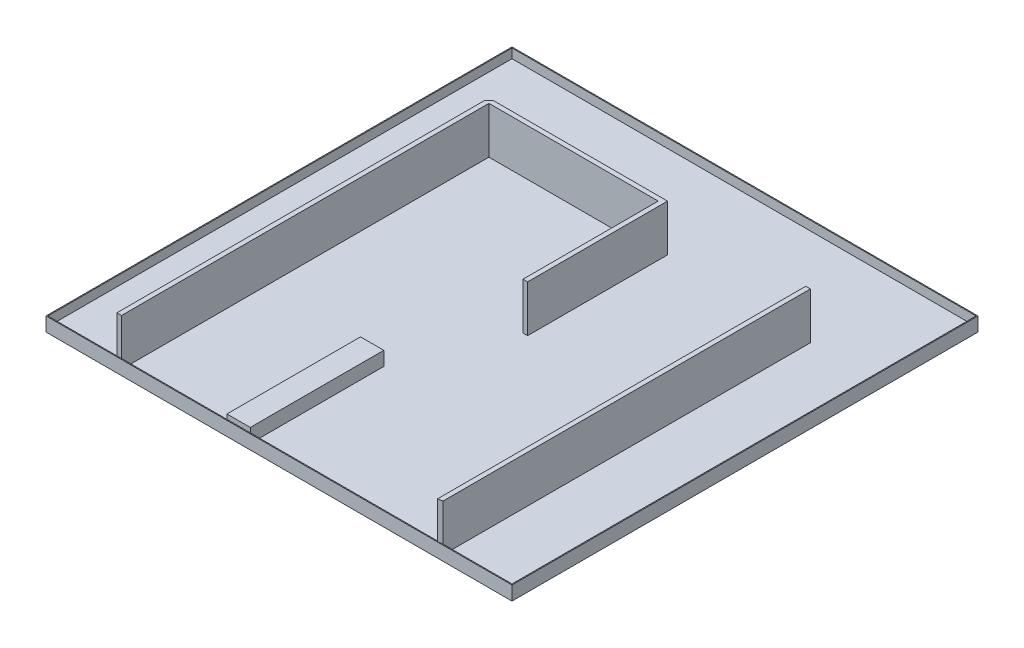
ISO-10303-21;
HEADER;
FILE_DESCRIPTION(('STEP AP214'),'2;1');
FILE_NAME('part.step','',(''),(''),'','','');
FILE_SCHEMA(('AUTOMOTIVE_DESIGN { 1 0 10303 214 1 1 1 1 }'));
ENDSEC;
DATA;
#1=APPLICATION_CONTEXT('core data for automotive mechanical design processes');
#2=APPLICATION_PROTOCOL_DEFINITION('international standard','automotive_design',2000,#1);
#3=PRODUCT_CONTEXT('',#1,'mechanical');
#4=PRODUCT('Part','Part','',(#3));
#5=PRODUCT_RELATED_PRODUCT_CATEGORY('part','',(#4));
#6=PRODUCT_DEFINITION_FORMATION('','',#4);
#7=PRODUCT_DEFINITION_CONTEXT('part definition',#1,'design');
#8=PRODUCT_DEFINITION('design','',#6,#7);
#9=PRODUCT_DEFINITION_SHAPE('','',#8);
#10=(LENGTH_UNIT() NAMED_UNIT(*) SI_UNIT(.MILLI.,.METRE.));
#11=(NAMED_UNIT(*) PLANE_ANGLE_UNIT() SI_UNIT($,.RADIAN.));
#12=(NAMED_UNIT(*) SI_UNIT($,.STERADIAN.) SOLID_ANGLE_UNIT());
#13=UNCERTAINTY_MEASURE_WITH_UNIT(LENGTH_MEASURE(1.E-05),#10,'distance_accuracy_value','');
#14=(GEOMETRIC_REPRESENTATION_CONTEXT(3) GLOBAL_UNCERTAINTY_ASSIGNED_CONTEXT((#13)) GLOBAL_UNIT_ASSIGNED_CONTEXT((#10,
#11,#12)) REPRESENTATION_CONTEXT('',''));
#15=CARTESIAN_POINT('',(0.,0.,0.));
#16=DIRECTION('',(0.,0.,1.));
#17=DIRECTION('',(1.,0.,0.));
#18=AXIS2_PLACEMENT_3D('',#15,#16,#17);
#19=CARTESIAN_POINT('',(-4980.,300.,4980.));
#20=DIRECTION('',(0.,0.,-1.));
#21=DIRECTION('',(-1.,0.,0.));
#22=AXIS2_PLACEMENT_3D('',#19,#20,#21);
#23=PLANE('',#22);
#24=DIRECTION('',(1.,0.,0.));
#25=VECTOR('',#24,1.);
#26=CARTESIAN_POINT('',(-4980.,100.,4980.));
#27=LINE('',#26,#25);
#28=CARTESIAN_POINT('',(-636.643182600913,100.,4980.));
#29=VERTEX_POINT('',#28);
#30=CARTESIAN_POINT('',(3400.,100.,4980.));
#31=VERTEX_POINT('',#30);
#32=EDGE_CURVE('E393',#29,#31,#27,.T.);
#33=ORIENTED_EDGE('',*,*,#32,.F.);
#34=DIRECTION('',(0.,-1.,0.));
#35=VECTOR('',#34,1.);
#36=CARTESIAN_POINT('',(-636.643182600912,400.,4980.));
#37=LINE('',#36,#35);
#38=CARTESIAN_POINT('',(-636.643182600912,300.,4980.));
#39=VERTEX_POINT('',#38);
#40=EDGE_CURVE('E490',#39,#29,#37,.T.);
#41=ORIENTED_EDGE('',*,*,#40,.F.);
#42=DIRECTION('',(1.,0.,0.));
#43=VECTOR('',#42,1.);
#44=CARTESIAN_POINT('',(-4980.,300.,4980.));
#45=LINE('',#44,#43);
#46=CARTESIAN_POINT('',(3400.,300.,4980.));
#47=VERTEX_POINT('',#46);
#48=EDGE_CURVE('E380',#39,#47,#45,.T.);
#49=ORIENTED_EDGE('',*,*,#48,.T.);
#50=DIRECTION('',(0.,-1.,0.));
#51=VECTOR('',#50,1.);
#52=CARTESIAN_POINT('',(3400.,300.,4980.));
#53=LINE('',#52,#51);
#54=EDGE_CURVE('E356',#47,#31,#53,.T.);
#55=ORIENTED_EDGE('',*,*,#54,.T.);
#56=EDGE_LOOP('',(#33,#41,#49,#55));
#57=FACE_BOUND('',#56,.T.);
#58=ADVANCED_FACE('F35',(#57),#23,.T.);
#59=CARTESIAN_POINT('',(-3397.93653042771,300.,4980.));
#60=VERTEX_POINT('',#59);
#61=CARTESIAN_POINT('',(-1136.64318260091,300.,4980.));
#62=VERTEX_POINT('',#61);
#63=EDGE_CURVE('E379',#60,#62,#45,.T.);
#64=ORIENTED_EDGE('',*,*,#63,.T.);
#65=DIRECTION('',(0.,-1.,0.));
#66=VECTOR('',#65,1.);
#67=CARTESIAN_POINT('',(-1136.64318260091,400.,4980.));
#68=LINE('',#67,#66);
#69=CARTESIAN_POINT('',(-1136.64318260091,100.,4980.));
#70=VERTEX_POINT('',#69);
#71=EDGE_CURVE('E491',#62,#70,#68,.T.);
#72=ORIENTED_EDGE('',*,*,#71,.T.);
#73=CARTESIAN_POINT('',(-3397.93653042772,100.,4980.));
#74=VERTEX_POINT('',#73);
#75=EDGE_CURVE('E392',#74,#70,#27,.T.);
#76=ORIENTED_EDGE('',*,*,#75,.F.);
#77=DIRECTION('',(0.,-1.,0.));
#78=VECTOR('',#77,1.);
#79=CARTESIAN_POINT('',(-3397.93653042771,1100.,4980.));
#80=LINE('',#79,#78);
#81=EDGE_CURVE('E311',#60,#74,#80,.T.);
#82=ORIENTED_EDGE('',*,*,#81,.F.);
#83=EDGE_LOOP('',(#64,#72,#76,#82));
#84=FACE_BOUND('',#83,.T.);
#85=ADVANCED_FACE('F501',(#84),#23,.T.);
#86=CARTESIAN_POINT('',(0.,100.,0.));
#87=DIRECTION('',(0.,-1.,0.));
#88=DIRECTION('',(0.,0.,-1.));
#89=AXIS2_PLACEMENT_3D('',#86,#87,#88);
#90=PLANE('',#89);
#91=DIRECTION('',(0.,0.,-1.));
#92=VECTOR('',#91,1.);
#93=CARTESIAN_POINT('',(-636.643182600912,100.,4980.));
#94=LINE('',#93,#92);
#95=CARTESIAN_POINT('',(-636.643182600912,100.,2114.56592078458));
#96=VERTEX_POINT('',#95);
#97=EDGE_CURVE('E244',#29,#96,#94,.T.);
#98=ORIENTED_EDGE('',*,*,#97,.F.);
#99=ORIENTED_EDGE('',*,*,#32,.T.);
#100=DIRECTION('',(0.,0.,1.));
#101=VECTOR('',#100,1.);
#102=CARTESIAN_POINT('',(3400.,100.,5000.));
#103=LINE('',#102,#101);
#104=CARTESIAN_POINT('',(3400.,100.,-2903.04812853476));
#105=VERTEX_POINT('',#104);
#106=EDGE_CURVE('E330',#105,#31,#103,.T.);
#107=ORIENTED_EDGE('',*,*,#106,.F.);
#108=DIRECTION('',(-1.,0.,0.));
#109=VECTOR('',#108,1.);
#110=CARTESIAN_POINT('',(3400.,100.,-2903.04812853476));
#111=LINE('',#110,#109);
#112=CARTESIAN_POINT('',(3500.,100.,-2903.04812853476));
#113=VERTEX_POINT('',#112);
#114=EDGE_CURVE('E339',#113,#105,#111,.T.);
#115=ORIENTED_EDGE('',*,*,#114,.F.);
#116=DIRECTION('',(0.,0.,-1.));
#117=VECTOR('',#116,1.);
#118=CARTESIAN_POINT('',(3500.,100.,4980.));
#119=LINE('',#118,#117);
#120=CARTESIAN_POINT('',(3500.,100.,4980.));
#121=VERTEX_POINT('',#120);
#122=EDGE_CURVE('E325',#121,#113,#119,.T.);
#123=ORIENTED_EDGE('',*,*,#122,.F.);
#124=CARTESIAN_POINT('',(4980.,100.,4980.));
#125=VERTEX_POINT('',#124);
#126=EDGE_CURVE('E389',#121,#125,#27,.T.);
#127=ORIENTED_EDGE('',*,*,#126,.T.);
#128=DIRECTION('',(0.,0.,-1.));
#129=VECTOR('',#128,1.);
#130=CARTESIAN_POINT('',(4980.,100.,4980.));
#131=LINE('',#130,#129);
#132=CARTESIAN_POINT('',(4980.,100.,-4980.));
#133=VERTEX_POINT('',#132);
#134=EDGE_CURVE('E365',#125,#133,#131,.T.);
#135=ORIENTED_EDGE('',*,*,#134,.T.);
#136=DIRECTION('',(-1.,0.,0.));
#137=VECTOR('',#136,1.);
#138=CARTESIAN_POINT('',(-4980.,100.,-4980.));
#139=LINE('',#138,#137);
#140=CARTESIAN_POINT('',(-4980.,100.,-4980.));
#141=VERTEX_POINT('',#140);
#142=EDGE_CURVE('E383',#133,#141,#139,.T.);
#143=ORIENTED_EDGE('',*,*,#142,.T.);
#144=DIRECTION('',(0.,0.,1.));
#145=VECTOR('',#144,1.);
#146=CARTESIAN_POINT('',(-4980.,100.,4980.));
#147=LINE('',#146,#145);
#148=CARTESIAN_POINT('',(-4980.,100.,4980.));
#149=VERTEX_POINT('',#148);
#150=EDGE_CURVE('E386',#141,#149,#147,.T.);
#151=ORIENTED_EDGE('',*,*,#150,.T.);
#152=CARTESIAN_POINT('',(-3497.93653042771,100.,4980.));
#153=VERTEX_POINT('',#152);
#154=EDGE_CURVE('E369',#149,#153,#27,.T.);
#155=ORIENTED_EDGE('',*,*,#154,.T.);
#156=DIRECTION('',(0.,0.,1.));
#157=VECTOR('',#156,1.);
#158=CARTESIAN_POINT('',(-3497.93653042772,100.,-2903.04812853476));
#159=LINE('',#158,#157);
#160=CARTESIAN_POINT('',(-3497.93653042771,100.,-2903.04812853476));
#161=VERTEX_POINT('',#160);
#162=EDGE_CURVE('E248',#161,#153,#159,.T.);
#163=ORIENTED_EDGE('',*,*,#162,.F.);
#164=DIRECTION('',(-0.707106781186546,0.,0.707106781186549));
#165=VECTOR('',#164,1.);
#166=CARTESIAN_POINT('',(-3497.93653042772,100.,-2903.04812853476));
#167=LINE('',#166,#165);
#168=CARTESIAN_POINT('',(-3397.93653042772,100.,-3003.04812853476));
#169=VERTEX_POINT('',#168);
#170=EDGE_CURVE('E245',#169,#161,#167,.T.);
#171=ORIENTED_EDGE('',*,*,#170,.F.);
#172=DIRECTION('',(-1.,0.,0.));
#173=VECTOR('',#172,1.);
#174=CARTESIAN_POINT('',(334.695730022103,100.,-3003.04812853476));
#175=LINE('',#174,#173);
#176=CARTESIAN_POINT('',(334.695730022103,100.,-3003.04812853476));
#177=VERTEX_POINT('',#176);
#178=EDGE_CURVE('E258',#177,#169,#175,.T.);
#179=ORIENTED_EDGE('',*,*,#178,.F.);
#180=DIRECTION('',(0.,0.,-1.));
#181=VECTOR('',#180,1.);
#182=CARTESIAN_POINT('',(334.695730022103,100.,-2903.04812853476));
#183=LINE('',#182,#181);
#184=CARTESIAN_POINT('',(334.695730022101,100.,0.));
#185=VERTEX_POINT('',#184);
#186=EDGE_CURVE('E289',#185,#177,#183,.T.);
#187=ORIENTED_EDGE('',*,*,#186,.F.);
#188=DIRECTION('',(1.,0.,0.));
#189=VECTOR('',#188,1.);
#190=CARTESIAN_POINT('',(234.695730022103,100.,0.));
#191=LINE('',#190,#189);
#192=CARTESIAN_POINT('',(234.695730022103,100.,0.));
#193=VERTEX_POINT('',#192);
#194=EDGE_CURVE('E286',#193,#185,#191,.T.);
#195=ORIENTED_EDGE('',*,*,#194,.F.);
#196=DIRECTION('',(0.,0.,1.));
#197=VECTOR('',#196,1.);
#198=CARTESIAN_POINT('',(234.695730022103,100.,-2903.04812853476));
#199=LINE('',#198,#197);
#200=CARTESIAN_POINT('',(234.695730022103,100.,-2903.04812853476));
#201=VERTEX_POINT('',#200);
#202=EDGE_CURVE('E283',#201,#193,#199,.T.);
#203=ORIENTED_EDGE('',*,*,#202,.F.);
#204=DIRECTION('',(1.,0.,0.));
#205=VECTOR('',#204,1.);
#206=CARTESIAN_POINT('',(234.695730022103,100.,-2903.04812853476));
#207=LINE('',#206,#205);
#208=CARTESIAN_POINT('',(-3397.93653042772,100.,-2903.04812853476));
#209=VERTEX_POINT('',#208);
#210=EDGE_CURVE('E280',#209,#201,#207,.T.);
#211=ORIENTED_EDGE('',*,*,#210,.F.);
#212=DIRECTION('',(0.,0.,-1.));
#213=VECTOR('',#212,1.);
#214=CARTESIAN_POINT('',(-3397.93653042772,100.,-2903.04812853476));
#215=LINE('',#214,#213);
#216=EDGE_CURVE('E277',#74,#209,#215,.T.);
#217=ORIENTED_EDGE('',*,*,#216,.F.);
#218=ORIENTED_EDGE('',*,*,#75,.T.);
#219=DIRECTION('',(0.,0.,1.));
#220=VECTOR('',#219,1.);
#221=CARTESIAN_POINT('',(-1136.64318260091,100.,4980.));
#222=LINE('',#221,#220);
#223=CARTESIAN_POINT('',(-1136.64318260091,100.,2114.56592078458));
#224=VERTEX_POINT('',#223);
#225=EDGE_CURVE('E55',#224,#70,#222,.T.);
#226=ORIENTED_EDGE('',*,*,#225,.F.);
#227=DIRECTION('',(-1.,0.,0.));
#228=VECTOR('',#227,1.);
#229=CARTESIAN_POINT('',(-636.643182600912,100.,2114.56592078458));
#230=LINE('',#229,#228);
#231=EDGE_CURVE('E50',#96,#224,#230,.T.);
#232=ORIENTED_EDGE('',*,*,#231,.F.);
#233=EDGE_LOOP('',(#98,#99,#107,#115,#123,#127,#135,#143,#151,#155,#163,#171,#179,#187,#195,
#203,#211,#217,#218,#226,#232));
#234=FACE_BOUND('',#233,.T.);
#235=ADVANCED_FACE('F468',(#234),#90,.F.);
#236=CARTESIAN_POINT('',(-4980.,300.,4980.));
#237=VERTEX_POINT('',#236);
#238=CARTESIAN_POINT('',(-3497.93653042771,300.,4980.));
#239=VERTEX_POINT('',#238);
#240=EDGE_CURVE('E375',#237,#239,#45,.T.);
#241=ORIENTED_EDGE('',*,*,#240,.T.);
#242=DIRECTION('',(0.,-1.,0.));
#243=VECTOR('',#242,1.);
#244=CARTESIAN_POINT('',(-3497.93653042771,1100.,4980.));
#245=LINE('',#244,#243);
#246=EDGE_CURVE('E315',#239,#153,#245,.T.);
#247=ORIENTED_EDGE('',*,*,#246,.T.);
#248=ORIENTED_EDGE('',*,*,#154,.F.);
#249=DIRECTION('',(0.,-1.,0.));
#250=VECTOR('',#249,1.);
#251=CARTESIAN_POINT('',(-4980.,300.,4980.));
#252=LINE('',#251,#250);
#253=EDGE_CURVE('E396',#237,#149,#252,.T.);
#254=ORIENTED_EDGE('',*,*,#253,.F.);
#255=EDGE_LOOP('',(#241,#247,#248,#254));
#256=FACE_BOUND('',#255,.T.);
#257=ADVANCED_FACE('F570',(#256),#23,.T.);
#258=CARTESIAN_POINT('',(0.,300.,0.));
#259=DIRECTION('',(0.,-1.,0.));
#260=DIRECTION('',(0.,0.,-1.));
#261=AXIS2_PLACEMENT_3D('',#258,#259,#260);
#262=PLANE('',#261);
#263=DIRECTION('',(0.980580675690921,0.,-0.196116135138181));
#264=VECTOR('',#263,1.);
#265=CARTESIAN_POINT('',(1092.30769230767,300.,5461.53846153846));
#266=LINE('',#265,#264);
#267=CARTESIAN_POINT('',(3400.,300.,5000.));
#268=VERTEX_POINT('',#267);
#269=CARTESIAN_POINT('',(3500.,300.,4980.));
#270=VERTEX_POINT('',#269);
#271=EDGE_CURVE('E362',#268,#270,#266,.T.);
#272=ORIENTED_EDGE('',*,*,#271,.F.);
#273=DIRECTION('',(1.,0.,0.));
#274=VECTOR('',#273,1.);
#275=CARTESIAN_POINT('',(-5000.,300.,5000.));
#276=LINE('',#275,#274);
#277=CARTESIAN_POINT('',(5000.,300.,5000.));
#278=VERTEX_POINT('',#277);
#279=EDGE_CURVE('E412',#268,#278,#276,.T.);
#280=ORIENTED_EDGE('',*,*,#279,.T.);
#281=DIRECTION('',(0.,0.,-1.));
#282=VECTOR('',#281,1.);
#283=CARTESIAN_POINT('',(5000.,300.,5000.));
#284=LINE('',#283,#282);
#285=CARTESIAN_POINT('',(5000.,300.,-5000.));
#286=VERTEX_POINT('',#285);
#287=EDGE_CURVE('E403',#278,#286,#284,.T.);
#288=ORIENTED_EDGE('',*,*,#287,.T.);
#289=DIRECTION('',(-1.,0.,0.));
#290=VECTOR('',#289,1.);
#291=CARTESIAN_POINT('',(-5000.,300.,-5000.));
#292=LINE('',#291,#290);
#293=CARTESIAN_POINT('',(-5000.,300.,-5000.));
#294=VERTEX_POINT('',#293);
#295=EDGE_CURVE('E406',#286,#294,#292,.T.);
#296=ORIENTED_EDGE('',*,*,#295,.T.);
#297=DIRECTION('',(0.,0.,1.));
#298=VECTOR('',#297,1.);
#299=CARTESIAN_POINT('',(-5000.,300.,5000.));
#300=LINE('',#299,#298);
#301=CARTESIAN_POINT('',(-5000.,300.,5000.));
#302=VERTEX_POINT('',#301);
#303=EDGE_CURVE('E409',#294,#302,#300,.T.);
#304=ORIENTED_EDGE('',*,*,#303,.T.);
#305=EDGE_CURVE('E413',#302,#268,#276,.T.);
#306=ORIENTED_EDGE('',*,*,#305,.T.);
#307=DIRECTION('',(0.,0.,1.));
#308=VECTOR('',#307,1.);
#309=CARTESIAN_POINT('',(3400.,300.,-1.91053285888334E-13));
#310=LINE('',#309,#308);
#311=EDGE_CURVE('E359',#47,#268,#310,.T.);
#312=ORIENTED_EDGE('',*,*,#311,.F.);
#313=ORIENTED_EDGE('',*,*,#48,.F.);
#314=EDGE_CURVE('E478',#62,#39,#45,.T.);
#315=ORIENTED_EDGE('',*,*,#314,.F.);
#316=ORIENTED_EDGE('',*,*,#63,.F.);
#317=DIRECTION('',(1.,0.,0.));
#318=VECTOR('',#317,1.);
#319=CARTESIAN_POINT('',(0.,300.,4980.));
#320=LINE('',#319,#318);
#321=EDGE_CURVE('E322',#239,#60,#320,.T.);
#322=ORIENTED_EDGE('',*,*,#321,.F.);
#323=ORIENTED_EDGE('',*,*,#240,.F.);
#324=DIRECTION('',(0.,0.,1.));
#325=VECTOR('',#324,1.);
#326=CARTESIAN_POINT('',(-4980.,300.,4980.));
#327=LINE('',#326,#325);
#328=CARTESIAN_POINT('',(-4980.,300.,-4980.));
#329=VERTEX_POINT('',#328);
#330=EDGE_CURVE('E371',#329,#237,#327,.T.);
#331=ORIENTED_EDGE('',*,*,#330,.F.);
#332=DIRECTION('',(-1.,0.,0.));
#333=VECTOR('',#332,1.);
#334=CARTESIAN_POINT('',(-4980.,300.,-4980.));
#335=LINE('',#334,#333);
#336=CARTESIAN_POINT('',(4980.,300.,-4980.));
#337=VERTEX_POINT('',#336);
#338=EDGE_CURVE('E368',#337,#329,#335,.T.);
#339=ORIENTED_EDGE('',*,*,#338,.F.);
#340=DIRECTION('',(0.,0.,-1.));
#341=VECTOR('',#340,1.);
#342=CARTESIAN_POINT('',(4980.,300.,4980.));
#343=LINE('',#342,#341);
#344=CARTESIAN_POINT('',(4980.,300.,4980.));
#345=VERTEX_POINT('',#344);
#346=EDGE_CURVE('E366',#345,#337,#343,.T.);
#347=ORIENTED_EDGE('',*,*,#346,.F.);
#348=EDGE_CURVE('E374',#270,#345,#45,.T.);
#349=ORIENTED_EDGE('',*,*,#348,.F.);
#350=EDGE_LOOP('',(#272,#280,#288,#296,#304,#306,#312,#313,#315,#316,#322,#323,#331,#339,#347,#349));
#351=FACE_BOUND('',#350,.T.);
#352=ADVANCED_FACE('F449',(#351),#262,.F.);
#353=ORIENTED_EDGE('',*,*,#126,.F.);
#354=DIRECTION('',(0.,-1.,0.));
#355=VECTOR('',#354,1.);
#356=CARTESIAN_POINT('',(3500.,1100.,4980.));
#357=LINE('',#356,#355);
#358=EDGE_CURVE('E352',#270,#121,#357,.T.);
#359=ORIENTED_EDGE('',*,*,#358,.F.);
#360=ORIENTED_EDGE('',*,*,#348,.T.);
#361=DIRECTION('',(0.,-1.,0.));
#362=VECTOR('',#361,1.);
#363=CARTESIAN_POINT('',(4980.,300.,4980.));
#364=LINE('',#363,#362);
#365=EDGE_CURVE('E378',#345,#125,#364,.T.);
#366=ORIENTED_EDGE('',*,*,#365,.T.);
#367=EDGE_LOOP('',(#353,#359,#360,#366));
#368=FACE_BOUND('',#367,.T.);
#369=ADVANCED_FACE('F474',(#368),#23,.T.);
#370=CARTESIAN_POINT('',(5000.,100.,5000.));
#371=DIRECTION('',(-1.,0.,0.));
#372=DIRECTION('',(0.,0.,1.));
#373=AXIS2_PLACEMENT_3D('',#370,#371,#372);
#374=PLANE('',#373);
#375=DIRECTION('',(0.,0.,-1.));
#376=VECTOR('',#375,1.);
#377=CARTESIAN_POINT('',(5000.,0.,5000.));
#378=LINE('',#377,#376);
#379=CARTESIAN_POINT('',(5000.,0.,5000.));
#380=VERTEX_POINT('',#379);
#381=CARTESIAN_POINT('',(5000.,0.,-5000.));
#382=VERTEX_POINT('',#381);
#383=EDGE_CURVE('E416',#380,#382,#378,.T.);
#384=ORIENTED_EDGE('',*,*,#383,.T.);
#385=DIRECTION('',(0.,-1.,0.));
#386=VECTOR('',#385,1.);
#387=CARTESIAN_POINT('',(5000.,100.,-5000.));
#388=LINE('',#387,#386);
#389=EDGE_CURVE('E11',#286,#382,#388,.T.);
#390=ORIENTED_EDGE('',*,*,#389,.F.);
#391=ORIENTED_EDGE('',*,*,#287,.F.);
#392=DIRECTION('',(0.,-1.,0.));
#393=VECTOR('',#392,1.);
#394=CARTESIAN_POINT('',(5000.,100.,5000.));
#395=LINE('',#394,#393);
#396=EDGE_CURVE('E425',#278,#380,#395,.T.);
#397=ORIENTED_EDGE('',*,*,#396,.T.);
#398=EDGE_LOOP('',(#384,#390,#391,#397));
#399=FACE_BOUND('',#398,.T.);
#400=ADVANCED_FACE('F37',(#399),#374,.F.);
#401=CARTESIAN_POINT('',(-5000.,100.,-5000.));
#402=DIRECTION('',(0.,0.,1.));
#403=DIRECTION('',(1.,0.,0.));
#404=AXIS2_PLACEMENT_3D('',#401,#402,#403);
#405=PLANE('',#404);
#406=DIRECTION('',(-1.,0.,0.));
#407=VECTOR('',#406,1.);
#408=CARTESIAN_POINT('',(-5000.,0.,-5000.));
#409=LINE('',#408,#407);
#410=CARTESIAN_POINT('',(-5000.,0.,-5000.));
#411=VERTEX_POINT('',#410);
#412=EDGE_CURVE('E419',#382,#411,#409,.T.);
#413=ORIENTED_EDGE('',*,*,#412,.T.);
#414=DIRECTION('',(0.,-1.,0.));
#415=VECTOR('',#414,1.);
#416=CARTESIAN_POINT('',(-5000.,100.,-5000.));
#417=LINE('',#416,#415);
#418=EDGE_CURVE('E43',#294,#411,#417,.T.);
#419=ORIENTED_EDGE('',*,*,#418,.F.);
#420=ORIENTED_EDGE('',*,*,#295,.F.);
#421=ORIENTED_EDGE('',*,*,#389,.T.);
#422=EDGE_LOOP('',(#413,#419,#420,#421));
#423=FACE_BOUND('',#422,.T.);
#424=ADVANCED_FACE('F579',(#423),#405,.F.);
#425=CARTESIAN_POINT('',(-5000.,100.,5000.));
#426=DIRECTION('',(1.,0.,0.));
#427=DIRECTION('',(0.,0.,-1.));
#428=AXIS2_PLACEMENT_3D('',#425,#426,#427);
#429=PLANE('',#428);
#430=DIRECTION('',(0.,0.,1.));
#431=VECTOR('',#430,1.);
#432=CARTESIAN_POINT('',(-5000.,0.,5000.));
#433=LINE('',#432,#431);
#434=CARTESIAN_POINT('',(-5000.,0.,5000.));
#435=VERTEX_POINT('',#434);
#436=EDGE_CURVE('E421',#411,#435,#433,.T.);
#437=ORIENTED_EDGE('',*,*,#436,.T.);
#438=DIRECTION('',(0.,-1.,0.));
#439=VECTOR('',#438,1.);
#440=CARTESIAN_POINT('',(-5000.,100.,5000.));
#441=LINE('',#440,#439);
#442=EDGE_CURVE('E428',#302,#435,#441,.T.);
#443=ORIENTED_EDGE('',*,*,#442,.F.);
#444=ORIENTED_EDGE('',*,*,#303,.F.);
#445=ORIENTED_EDGE('',*,*,#418,.T.);
#446=EDGE_LOOP('',(#437,#443,#444,#445));
#447=FACE_BOUND('',#446,.T.);
#448=ADVANCED_FACE('F434',(#447),#429,.F.);
#449=CARTESIAN_POINT('',(-5000.,100.,5000.));
#450=DIRECTION('',(0.,0.,-1.));
#451=DIRECTION('',(-1.,0.,0.));
#452=AXIS2_PLACEMENT_3D('',#449,#450,#451);
#453=PLANE('',#452);
#454=DIRECTION('',(1.,0.,0.));
#455=VECTOR('',#454,1.);
#456=CARTESIAN_POINT('',(-5000.,0.,5000.));
#457=LINE('',#456,#455);
#458=EDGE_CURVE('E423',#435,#380,#457,.T.);
#459=ORIENTED_EDGE('',*,*,#458,.T.);
#460=ORIENTED_EDGE('',*,*,#396,.F.);
#461=ORIENTED_EDGE('',*,*,#279,.F.);
#462=ORIENTED_EDGE('',*,*,#305,.F.);
#463=ORIENTED_EDGE('',*,*,#442,.T.);
#464=EDGE_LOOP('',(#459,#460,#461,#462,#463));
#465=FACE_BOUND('',#464,.T.);
#466=ADVANCED_FACE('F443',(#465),#453,.F.);
#467=CARTESIAN_POINT('',(0.,0.,0.));
#468=DIRECTION('',(0.,-1.,0.));
#469=DIRECTION('',(0.,0.,-1.));
#470=AXIS2_PLACEMENT_3D('',#467,#468,#469);
#471=PLANE('',#470);
#472=ORIENTED_EDGE('',*,*,#383,.F.);
#473=ORIENTED_EDGE('',*,*,#458,.F.);
#474=ORIENTED_EDGE('',*,*,#436,.F.);
#475=ORIENTED_EDGE('',*,*,#412,.F.);
#476=EDGE_LOOP('',(#472,#473,#474,#475));
#477=FACE_BOUND('',#476,.T.);
#478=ADVANCED_FACE('F440',(#477),#471,.T.);
#479=CARTESIAN_POINT('',(4980.,300.,4980.));
#480=DIRECTION('',(-1.,0.,0.));
#481=DIRECTION('',(0.,0.,1.));
#482=AXIS2_PLACEMENT_3D('',#479,#480,#481);
#483=PLANE('',#482);
#484=ORIENTED_EDGE('',*,*,#134,.F.);
#485=ORIENTED_EDGE('',*,*,#365,.F.);
#486=ORIENTED_EDGE('',*,*,#346,.T.);
#487=DIRECTION('',(0.,-1.,0.));
#488=VECTOR('',#487,1.);
#489=CARTESIAN_POINT('',(4980.,300.,-4980.));
#490=LINE('',#489,#488);
#491=EDGE_CURVE('E400',#337,#133,#490,.T.);
#492=ORIENTED_EDGE('',*,*,#491,.T.);
#493=EDGE_LOOP('',(#484,#485,#486,#492));
#494=FACE_BOUND('',#493,.T.);
#495=ADVANCED_FACE('F505',(#494),#483,.T.);
#496=CARTESIAN_POINT('',(-4980.,300.,-4980.));
#497=DIRECTION('',(0.,0.,1.));
#498=DIRECTION('',(1.,0.,0.));
#499=AXIS2_PLACEMENT_3D('',#496,#497,#498);
#500=PLANE('',#499);
#501=ORIENTED_EDGE('',*,*,#142,.F.);
#502=ORIENTED_EDGE('',*,*,#491,.F.);
#503=ORIENTED_EDGE('',*,*,#338,.T.);
#504=DIRECTION('',(0.,-1.,0.));
#505=VECTOR('',#504,1.);
#506=CARTESIAN_POINT('',(-4980.,300.,-4980.));
#507=LINE('',#506,#505);
#508=EDGE_CURVE('E398',#329,#141,#507,.T.);
#509=ORIENTED_EDGE('',*,*,#508,.T.);
#510=EDGE_LOOP('',(#501,#502,#503,#509));
#511=FACE_BOUND('',#510,.T.);
#512=ADVANCED_FACE('F508',(#511),#500,.T.);
#513=CARTESIAN_POINT('',(-4980.,300.,4980.));
#514=DIRECTION('',(1.,0.,0.));
#515=DIRECTION('',(0.,0.,-1.));
#516=AXIS2_PLACEMENT_3D('',#513,#514,#515);
#517=PLANE('',#516);
#518=ORIENTED_EDGE('',*,*,#150,.F.);
#519=ORIENTED_EDGE('',*,*,#508,.F.);
#520=ORIENTED_EDGE('',*,*,#330,.T.);
#521=ORIENTED_EDGE('',*,*,#253,.T.);
#522=EDGE_LOOP('',(#518,#519,#520,#521));
#523=FACE_BOUND('',#522,.T.);
#524=ADVANCED_FACE('F514',(#523),#517,.T.);
#525=CARTESIAN_POINT('',(3400.,1100.,5000.));
#526=DIRECTION('',(-0.196116135138181,0.,-0.980580675690921));
#527=DIRECTION('',(-0.980580675690921,0.,0.196116135138181));
#528=AXIS2_PLACEMENT_3D('',#525,#526,#527);
#529=PLANE('',#528);
#530=DIRECTION('',(0.,-1.,0.));
#531=VECTOR('',#530,1.);
#532=CARTESIAN_POINT('',(3400.,1100.,5000.));
#533=LINE('',#532,#531);
#534=CARTESIAN_POINT('',(3400.,1100.,5000.));
#535=VERTEX_POINT('',#534);
#536=EDGE_CURVE('E336',#535,#268,#533,.T.);
#537=ORIENTED_EDGE('',*,*,#536,.T.);
#538=ORIENTED_EDGE('',*,*,#271,.T.);
#539=CARTESIAN_POINT('',(3500.,1100.,4980.));
#540=VERTEX_POINT('',#539);
#541=EDGE_CURVE('E353',#540,#270,#357,.T.);
#542=ORIENTED_EDGE('',*,*,#541,.F.);
#543=DIRECTION('',(0.980580675690921,0.,-0.196116135138181));
#544=VECTOR('',#543,1.);
#545=CARTESIAN_POINT('',(3400.,1100.,5000.));
#546=LINE('',#545,#544);
#547=EDGE_CURVE('E326',#535,#540,#546,.T.);
#548=ORIENTED_EDGE('',*,*,#547,.F.);
#549=EDGE_LOOP('',(#537,#538,#542,#548));
#550=FACE_BOUND('',#549,.T.);
#551=ADVANCED_FACE('F459',(#550),#529,.F.);
#552=CARTESIAN_POINT('',(3400.,1100.,5000.));
#553=DIRECTION('',(1.,0.,0.));
#554=DIRECTION('',(0.,0.,-1.));
#555=AXIS2_PLACEMENT_3D('',#552,#553,#554);
#556=PLANE('',#555);
#557=ORIENTED_EDGE('',*,*,#54,.F.);
#558=ORIENTED_EDGE('',*,*,#311,.T.);
#559=ORIENTED_EDGE('',*,*,#536,.F.);
#560=DIRECTION('',(0.,0.,1.));
#561=VECTOR('',#560,1.);
#562=CARTESIAN_POINT('',(3400.,1100.,5000.));
#563=LINE('',#562,#561);
#564=CARTESIAN_POINT('',(3400.,1100.,-2903.04812853476));
#565=VERTEX_POINT('',#564);
#566=EDGE_CURVE('E334',#565,#535,#563,.T.);
#567=ORIENTED_EDGE('',*,*,#566,.F.);
#568=DIRECTION('',(0.,-1.,0.));
#569=VECTOR('',#568,1.);
#570=CARTESIAN_POINT('',(3400.,1100.,-2903.04812853476));
#571=LINE('',#570,#569);
#572=EDGE_CURVE('E346',#565,#105,#571,.T.);
#573=ORIENTED_EDGE('',*,*,#572,.T.);
#574=ORIENTED_EDGE('',*,*,#106,.T.);
#575=EDGE_LOOP('',(#557,#558,#559,#567,#573,#574));
#576=FACE_BOUND('',#575,.T.);
#577=ADVANCED_FACE('F455',(#576),#556,.F.);
#578=CARTESIAN_POINT('',(3500.,1100.,4980.));
#579=DIRECTION('',(-1.,0.,0.));
#580=DIRECTION('',(0.,0.,1.));
#581=AXIS2_PLACEMENT_3D('',#578,#579,#580);
#582=PLANE('',#581);
#583=ORIENTED_EDGE('',*,*,#122,.T.);
#584=DIRECTION('',(0.,-1.,0.));
#585=VECTOR('',#584,1.);
#586=CARTESIAN_POINT('',(3500.,1100.,-2903.04812853476));
#587=LINE('',#586,#585);
#588=CARTESIAN_POINT('',(3500.,1100.,-2903.04812853476));
#589=VERTEX_POINT('',#588);
#590=EDGE_CURVE('E349',#589,#113,#587,.T.);
#591=ORIENTED_EDGE('',*,*,#590,.F.);
#592=DIRECTION('',(0.,0.,-1.));
#593=VECTOR('',#592,1.);
#594=CARTESIAN_POINT('',(3500.,1100.,4980.));
#595=LINE('',#594,#593);
#596=EDGE_CURVE('E329',#540,#589,#595,.T.);
#597=ORIENTED_EDGE('',*,*,#596,.F.);
#598=ORIENTED_EDGE('',*,*,#541,.T.);
#599=ORIENTED_EDGE('',*,*,#358,.T.);
#600=EDGE_LOOP('',(#583,#591,#597,#598,#599));
#601=FACE_BOUND('',#600,.T.);
#602=ADVANCED_FACE('F472',(#601),#582,.F.);
#603=CARTESIAN_POINT('',(3400.,1100.,-2903.04812853476));
#604=DIRECTION('',(0.,0.,1.));
#605=DIRECTION('',(1.,0.,0.));
#606=AXIS2_PLACEMENT_3D('',#603,#604,#605);
#607=PLANE('',#606);
#608=ORIENTED_EDGE('',*,*,#114,.T.);
#609=ORIENTED_EDGE('',*,*,#572,.F.);
#610=DIRECTION('',(-1.,0.,0.));
#611=VECTOR('',#610,1.);
#612=CARTESIAN_POINT('',(3400.,1100.,-2903.04812853476));
#613=LINE('',#612,#611);
#614=EDGE_CURVE('E332',#589,#565,#613,.T.);
#615=ORIENTED_EDGE('',*,*,#614,.F.);
#616=ORIENTED_EDGE('',*,*,#590,.T.);
#617=EDGE_LOOP('',(#608,#609,#615,#616));
#618=FACE_BOUND('',#617,.T.);
#619=ADVANCED_FACE('F467',(#618),#607,.F.);
#620=CARTESIAN_POINT('',(0.,1100.,0.));
#621=DIRECTION('',(0.,1.,0.));
#622=DIRECTION('',(0.,0.,1.));
#623=AXIS2_PLACEMENT_3D('',#620,#621,#622);
#624=PLANE('',#623);
#625=ORIENTED_EDGE('',*,*,#547,.T.);
#626=ORIENTED_EDGE('',*,*,#596,.T.);
#627=ORIENTED_EDGE('',*,*,#614,.T.);
#628=ORIENTED_EDGE('',*,*,#566,.T.);
#629=EDGE_LOOP('',(#625,#626,#627,#628));
#630=FACE_BOUND('',#629,.T.);
#631=ADVANCED_FACE('F462',(#630),#624,.T.);
#632=CARTESIAN_POINT('',(-3497.93653042771,1100.,4980.));
#633=DIRECTION('',(0.,0.,-1.));
#634=DIRECTION('',(-1.,0.,0.));
#635=AXIS2_PLACEMENT_3D('',#632,#633,#634);
#636=PLANE('',#635);
#637=CARTESIAN_POINT('',(-3497.93653042771,1100.,4980.));
#638=VERTEX_POINT('',#637);
#639=EDGE_CURVE('E316',#638,#239,#245,.T.);
#640=ORIENTED_EDGE('',*,*,#639,.T.);
#641=ORIENTED_EDGE('',*,*,#321,.T.);
#642=CARTESIAN_POINT('',(-3397.93653042771,1100.,4980.));
#643=VERTEX_POINT('',#642);
#644=EDGE_CURVE('E312',#643,#60,#80,.T.);
#645=ORIENTED_EDGE('',*,*,#644,.F.);
#646=DIRECTION('',(1.,0.,0.));
#647=VECTOR('',#646,1.);
#648=CARTESIAN_POINT('',(-3497.93653042771,1100.,4980.));
#649=LINE('',#648,#647);
#650=EDGE_CURVE('E260',#638,#643,#649,.T.);
#651=ORIENTED_EDGE('',*,*,#650,.F.);
#652=EDGE_LOOP('',(#640,#641,#645,#651));
#653=FACE_BOUND('',#652,.T.);
#654=ADVANCED_FACE('F551',(#653),#636,.F.);
#655=CARTESIAN_POINT('',(-3497.93653042772,1100.,-2903.04812853476));
#656=DIRECTION('',(0.707106781186549,0.,0.707106781186546));
#657=DIRECTION('',(0.707106781186546,0.,-0.707106781186549));
#658=AXIS2_PLACEMENT_3D('',#655,#656,#657);
#659=PLANE('',#658);
#660=ORIENTED_EDGE('',*,*,#170,.T.);
#661=DIRECTION('',(0.,-1.,0.));
#662=VECTOR('',#661,1.);
#663=CARTESIAN_POINT('',(-3497.93653042772,1100.,-2903.04812853476));
#664=LINE('',#663,#662);
#665=CARTESIAN_POINT('',(-3497.93653042772,1100.,-2903.04812853476));
#666=VERTEX_POINT('',#665);
#667=EDGE_CURVE('E319',#666,#161,#664,.T.);
#668=ORIENTED_EDGE('',*,*,#667,.F.);
#669=DIRECTION('',(-0.707106781186546,0.,0.707106781186549));
#670=VECTOR('',#669,1.);
#671=CARTESIAN_POINT('',(-3497.93653042772,1100.,-2903.04812853476));
#672=LINE('',#671,#670);
#673=CARTESIAN_POINT('',(-3397.93653042772,1100.,-3003.04812853476));
#674=VERTEX_POINT('',#673);
#675=EDGE_CURVE('E254',#674,#666,#672,.T.);
#676=ORIENTED_EDGE('',*,*,#675,.F.);
#677=DIRECTION('',(0.,-1.,0.));
#678=VECTOR('',#677,1.);
#679=CARTESIAN_POINT('',(-3397.93653042772,1100.,-3003.04812853476));
#680=LINE('',#679,#678);
#681=EDGE_CURVE('E273',#674,#169,#680,.T.);
#682=ORIENTED_EDGE('',*,*,#681,.T.);
#683=EDGE_LOOP('',(#660,#668,#676,#682));
#684=FACE_BOUND('',#683,.T.);
#685=ADVANCED_FACE('F524',(#684),#659,.F.);
#686=CARTESIAN_POINT('',(-3497.93653042772,1100.,-2903.04812853476));
#687=DIRECTION('',(1.,0.,0.));
#688=DIRECTION('',(0.,0.,-1.));
#689=AXIS2_PLACEMENT_3D('',#686,#687,#688);
#690=PLANE('',#689);
#691=ORIENTED_EDGE('',*,*,#162,.T.);
#692=ORIENTED_EDGE('',*,*,#246,.F.);
#693=ORIENTED_EDGE('',*,*,#639,.F.);
#694=DIRECTION('',(0.,0.,1.));
#695=VECTOR('',#694,1.);
#696=CARTESIAN_POINT('',(-3497.93653042772,1100.,-2903.04812853476));
#697=LINE('',#696,#695);
#698=EDGE_CURVE('E257',#666,#638,#697,.T.);
#699=ORIENTED_EDGE('',*,*,#698,.F.);
#700=ORIENTED_EDGE('',*,*,#667,.T.);
#701=EDGE_LOOP('',(#691,#692,#693,#699,#700));
#702=FACE_BOUND('',#701,.T.);
#703=ADVANCED_FACE('F519',(#702),#690,.F.);
#704=CARTESIAN_POINT('',(-3397.93653042772,1100.,-2903.04812853476));
#705=DIRECTION('',(-1.,0.,0.));
#706=DIRECTION('',(0.,0.,1.));
#707=AXIS2_PLACEMENT_3D('',#704,#705,#706);
#708=PLANE('',#707);
#709=ORIENTED_EDGE('',*,*,#216,.T.);
#710=DIRECTION('',(0.,-1.,0.));
#711=VECTOR('',#710,1.);
#712=CARTESIAN_POINT('',(-3397.93653042772,1100.,-2903.04812853476));
#713=LINE('',#712,#711);
#714=CARTESIAN_POINT('',(-3397.93653042772,1100.,-2903.04812853476));
#715=VERTEX_POINT('',#714);
#716=EDGE_CURVE('E308',#715,#209,#713,.T.);
#717=ORIENTED_EDGE('',*,*,#716,.F.);
#718=DIRECTION('',(0.,0.,-1.));
#719=VECTOR('',#718,1.);
#720=CARTESIAN_POINT('',(-3397.93653042772,1100.,-2903.04812853476));
#721=LINE('',#720,#719);
#722=EDGE_CURVE('E262',#643,#715,#721,.T.);
#723=ORIENTED_EDGE('',*,*,#722,.F.);
#724=ORIENTED_EDGE('',*,*,#644,.T.);
#725=ORIENTED_EDGE('',*,*,#81,.T.);
#726=EDGE_LOOP('',(#709,#717,#723,#724,#725));
#727=FACE_BOUND('',#726,.T.);
#728=ADVANCED_FACE('F548',(#727),#708,.F.);
#729=CARTESIAN_POINT('',(234.695730022103,1100.,-2903.04812853476));
#730=DIRECTION('',(0.,0.,-1.));
#731=DIRECTION('',(-1.,0.,0.));
#732=AXIS2_PLACEMENT_3D('',#729,#730,#731);
#733=PLANE('',#732);
#734=ORIENTED_EDGE('',*,*,#210,.T.);
#735=DIRECTION('',(0.,-1.,0.));
#736=VECTOR('',#735,1.);
#737=CARTESIAN_POINT('',(234.695730022103,1100.,-2903.04812853476));
#738=LINE('',#737,#736);
#739=CARTESIAN_POINT('',(234.695730022103,1100.,-2903.04812853476));
#740=VERTEX_POINT('',#739);
#741=EDGE_CURVE('E305',#740,#201,#738,.T.);
#742=ORIENTED_EDGE('',*,*,#741,.F.);
#743=DIRECTION('',(1.,0.,0.));
#744=VECTOR('',#743,1.);
#745=CARTESIAN_POINT('',(234.695730022103,1100.,-2903.04812853476));
#746=LINE('',#745,#744);
#747=EDGE_CURVE('E264',#715,#740,#746,.T.);
#748=ORIENTED_EDGE('',*,*,#747,.F.);
#749=ORIENTED_EDGE('',*,*,#716,.T.);
#750=EDGE_LOOP('',(#734,#742,#748,#749));
#751=FACE_BOUND('',#750,.T.);
#752=ADVANCED_FACE('F543',(#751),#733,.F.);
#753=CARTESIAN_POINT('',(234.695730022103,1100.,-2903.04812853476));
#754=DIRECTION('',(1.,0.,0.));
#755=DIRECTION('',(0.,0.,-1.));
#756=AXIS2_PLACEMENT_3D('',#753,#754,#755);
#757=PLANE('',#756);
#758=ORIENTED_EDGE('',*,*,#202,.T.);
#759=DIRECTION('',(0.,-1.,0.));
#760=VECTOR('',#759,1.);
#761=CARTESIAN_POINT('',(234.695730022103,1100.,0.));
#762=LINE('',#761,#760);
#763=CARTESIAN_POINT('',(234.695730022103,1100.,0.));
#764=VERTEX_POINT('',#763);
#765=EDGE_CURVE('E302',#764,#193,#762,.T.);
#766=ORIENTED_EDGE('',*,*,#765,.F.);
#767=DIRECTION('',(0.,0.,1.));
#768=VECTOR('',#767,1.);
#769=CARTESIAN_POINT('',(234.695730022103,1100.,-2903.04812853476));
#770=LINE('',#769,#768);
#771=EDGE_CURVE('E266',#740,#764,#770,.T.);
#772=ORIENTED_EDGE('',*,*,#771,.F.);
#773=ORIENTED_EDGE('',*,*,#741,.T.);
#774=EDGE_LOOP('',(#758,#766,#772,#773));
#775=FACE_BOUND('',#774,.T.);
#776=ADVANCED_FACE('F540',(#775),#757,.F.);
#777=CARTESIAN_POINT('',(234.695730022103,1100.,0.));
#778=DIRECTION('',(0.,0.,-1.));
#779=DIRECTION('',(-1.,0.,0.));
#780=AXIS2_PLACEMENT_3D('',#777,#778,#779);
#781=PLANE('',#780);
#782=ORIENTED_EDGE('',*,*,#194,.T.);
#783=DIRECTION('',(0.,-1.,0.));
#784=VECTOR('',#783,1.);
#785=CARTESIAN_POINT('',(334.695730022103,1100.,0.));
#786=LINE('',#785,#784);
#787=CARTESIAN_POINT('',(334.695730022103,1100.,0.));
#788=VERTEX_POINT('',#787);
#789=EDGE_CURVE('E299',#788,#185,#786,.T.);
#790=ORIENTED_EDGE('',*,*,#789,.F.);
#791=DIRECTION('',(1.,0.,0.));
#792=VECTOR('',#791,1.);
#793=CARTESIAN_POINT('',(234.695730022103,1100.,0.));
#794=LINE('',#793,#792);
#795=EDGE_CURVE('E268',#764,#788,#794,.T.);
#796=ORIENTED_EDGE('',*,*,#795,.F.);
#797=ORIENTED_EDGE('',*,*,#765,.T.);
#798=EDGE_LOOP('',(#782,#790,#796,#797));
#799=FACE_BOUND('',#798,.T.);
#800=ADVANCED_FACE('F535',(#799),#781,.F.);
#801=CARTESIAN_POINT('',(334.695730022103,1100.,-2903.04812853476));
#802=DIRECTION('',(-1.,0.,0.));
#803=DIRECTION('',(0.,0.,1.));
#804=AXIS2_PLACEMENT_3D('',#801,#802,#803);
#805=PLANE('',#804);
#806=ORIENTED_EDGE('',*,*,#186,.T.);
#807=DIRECTION('',(0.,-1.,0.));
#808=VECTOR('',#807,1.);
#809=CARTESIAN_POINT('',(334.695730022103,1100.,-3003.04812853476));
#810=LINE('',#809,#808);
#811=CARTESIAN_POINT('',(334.695730022103,1100.,-3003.04812853476));
#812=VERTEX_POINT('',#811);
#813=EDGE_CURVE('E296',#812,#177,#810,.T.);
#814=ORIENTED_EDGE('',*,*,#813,.F.);
#815=DIRECTION('',(0.,0.,-1.));
#816=VECTOR('',#815,1.);
#817=CARTESIAN_POINT('',(334.695730022103,1100.,-2903.04812853476));
#818=LINE('',#817,#816);
#819=EDGE_CURVE('E270',#788,#812,#818,.T.);
#820=ORIENTED_EDGE('',*,*,#819,.F.);
#821=ORIENTED_EDGE('',*,*,#789,.T.);
#822=EDGE_LOOP('',(#806,#814,#820,#821));
#823=FACE_BOUND('',#822,.T.);
#824=ADVANCED_FACE('F532',(#823),#805,.F.);
#825=CARTESIAN_POINT('',(334.695730022103,1100.,-3003.04812853476));
#826=DIRECTION('',(0.,0.,1.));
#827=DIRECTION('',(1.,0.,0.));
#828=AXIS2_PLACEMENT_3D('',#825,#826,#827);
#829=PLANE('',#828);
#830=ORIENTED_EDGE('',*,*,#178,.T.);
#831=ORIENTED_EDGE('',*,*,#681,.F.);
#832=DIRECTION('',(-1.,0.,0.));
#833=VECTOR('',#832,1.);
#834=CARTESIAN_POINT('',(334.695730022103,1100.,-3003.04812853476));
#835=LINE('',#834,#833);
#836=EDGE_CURVE('E272',#812,#674,#835,.T.);
#837=ORIENTED_EDGE('',*,*,#836,.F.);
#838=ORIENTED_EDGE('',*,*,#813,.T.);
#839=EDGE_LOOP('',(#830,#831,#837,#838));
#840=FACE_BOUND('',#839,.T.);
#841=ADVANCED_FACE('F527',(#840),#829,.F.);
#842=CARTESIAN_POINT('',(0.,1100.,0.));
#843=DIRECTION('',(0.,1.,0.));
#844=DIRECTION('',(0.,0.,1.));
#845=AXIS2_PLACEMENT_3D('',#842,#843,#844);
#846=PLANE('',#845);
#847=ORIENTED_EDGE('',*,*,#675,.T.);
#848=ORIENTED_EDGE('',*,*,#698,.T.);
#849=ORIENTED_EDGE('',*,*,#650,.T.);
#850=ORIENTED_EDGE('',*,*,#722,.T.);
#851=ORIENTED_EDGE('',*,*,#747,.T.);
#852=ORIENTED_EDGE('',*,*,#771,.T.);
#853=ORIENTED_EDGE('',*,*,#795,.T.);
#854=ORIENTED_EDGE('',*,*,#819,.T.);
#855=ORIENTED_EDGE('',*,*,#836,.T.);
#856=EDGE_LOOP('',(#847,#848,#849,#850,#851,#852,#853,#854,#855));
#857=FACE_BOUND('',#856,.T.);
#858=ADVANCED_FACE('F554',(#857),#846,.T.);
#859=CARTESIAN_POINT('',(-636.643182600912,400.,4980.));
#860=DIRECTION('',(0.,0.,-1.));
#861=DIRECTION('',(-1.,0.,0.));
#862=AXIS2_PLACEMENT_3D('',#859,#860,#861);
#863=PLANE('',#862);
#864=CARTESIAN_POINT('',(-1136.64318260091,400.,4980.));
#865=VERTEX_POINT('',#864);
#866=EDGE_CURVE('E250',#865,#62,#68,.T.);
#867=ORIENTED_EDGE('',*,*,#866,.T.);
#868=ORIENTED_EDGE('',*,*,#314,.T.);
#869=CARTESIAN_POINT('',(-636.643182600912,400.,4980.));
#870=VERTEX_POINT('',#869);
#871=EDGE_CURVE('E487',#870,#39,#37,.T.);
#872=ORIENTED_EDGE('',*,*,#871,.F.);
#873=DIRECTION('',(1.,0.,0.));
#874=VECTOR('',#873,1.);
#875=CARTESIAN_POINT('',(-636.643182600912,400.,4980.));
#876=LINE('',#875,#874);
#877=EDGE_CURVE('E237',#865,#870,#876,.T.);
#878=ORIENTED_EDGE('',*,*,#877,.F.);
#879=EDGE_LOOP('',(#867,#868,#872,#878));
#880=FACE_BOUND('',#879,.T.);
#881=ADVANCED_FACE('F486',(#880),#863,.F.);
#882=CARTESIAN_POINT('',(-636.643182600912,400.,4980.));
#883=DIRECTION('',(-1.,0.,0.));
#884=DIRECTION('',(0.,0.,1.));
#885=AXIS2_PLACEMENT_3D('',#882,#883,#884);
#886=PLANE('',#885);
#887=ORIENTED_EDGE('',*,*,#97,.T.);
#888=DIRECTION('',(0.,-1.,0.));
#889=VECTOR('',#888,1.);
#890=CARTESIAN_POINT('',(-636.643182600912,400.,2114.56592078458));
#891=LINE('',#890,#889);
#892=CARTESIAN_POINT('',(-636.643182600912,400.,2114.56592078458));
#893=VERTEX_POINT('',#892);
#894=EDGE_CURVE('E225',#893,#96,#891,.T.);
#895=ORIENTED_EDGE('',*,*,#894,.F.);
#896=DIRECTION('',(0.,0.,-1.));
#897=VECTOR('',#896,1.);
#898=CARTESIAN_POINT('',(-636.643182600912,400.,4980.));
#899=LINE('',#898,#897);
#900=EDGE_CURVE('E232',#870,#893,#899,.T.);
#901=ORIENTED_EDGE('',*,*,#900,.F.);
#902=ORIENTED_EDGE('',*,*,#871,.T.);
#903=ORIENTED_EDGE('',*,*,#40,.T.);
#904=EDGE_LOOP('',(#887,#895,#901,#902,#903));
#905=FACE_BOUND('',#904,.T.);
#906=ADVANCED_FACE('F242',(#905),#886,.F.);
#907=CARTESIAN_POINT('',(-636.643182600912,400.,2114.56592078458));
#908=DIRECTION('',(0.,0.,1.));
#909=DIRECTION('',(1.,0.,0.));
#910=AXIS2_PLACEMENT_3D('',#907,#908,#909);
#911=PLANE('',#910);
#912=ORIENTED_EDGE('',*,*,#231,.T.);
#913=DIRECTION('',(0.,-1.,0.));
#914=VECTOR('',#913,1.);
#915=CARTESIAN_POINT('',(-1136.64318260091,400.,2114.56592078458));
#916=LINE('',#915,#914);
#917=CARTESIAN_POINT('',(-1136.64318260091,400.,2114.56592078458));
#918=VERTEX_POINT('',#917);
#919=EDGE_CURVE('E228',#918,#224,#916,.T.);
#920=ORIENTED_EDGE('',*,*,#919,.F.);
#921=DIRECTION('',(-1.,0.,0.));
#922=VECTOR('',#921,1.);
#923=CARTESIAN_POINT('',(-636.643182600912,400.,2114.56592078458));
#924=LINE('',#923,#922);
#925=EDGE_CURVE('E221',#893,#918,#924,.T.);
#926=ORIENTED_EDGE('',*,*,#925,.F.);
#927=ORIENTED_EDGE('',*,*,#894,.T.);
#928=EDGE_LOOP('',(#912,#920,#926,#927));
#929=FACE_BOUND('',#928,.T.);
#930=ADVANCED_FACE('F223',(#929),#911,.F.);
#931=CARTESIAN_POINT('',(-1136.64318260091,400.,4980.));
#932=DIRECTION('',(1.,0.,0.));
#933=DIRECTION('',(0.,0.,-1.));
#934=AXIS2_PLACEMENT_3D('',#931,#932,#933);
#935=PLANE('',#934);
#936=ORIENTED_EDGE('',*,*,#225,.T.);
#937=ORIENTED_EDGE('',*,*,#71,.F.);
#938=ORIENTED_EDGE('',*,*,#866,.F.);
#939=DIRECTION('',(0.,0.,1.));
#940=VECTOR('',#939,1.);
#941=CARTESIAN_POINT('',(-1136.64318260091,400.,4980.));
#942=LINE('',#941,#940);
#943=EDGE_CURVE('E231',#918,#865,#942,.T.);
#944=ORIENTED_EDGE('',*,*,#943,.F.);
#945=ORIENTED_EDGE('',*,*,#919,.T.);
#946=EDGE_LOOP('',(#936,#937,#938,#944,#945));
#947=FACE_BOUND('',#946,.T.);
#948=ADVANCED_FACE('F499',(#947),#935,.F.);
#949=CARTESIAN_POINT('',(0.,400.,0.));
#950=DIRECTION('',(0.,1.,0.));
#951=DIRECTION('',(0.,0.,1.));
#952=AXIS2_PLACEMENT_3D('',#949,#950,#951);
#953=PLANE('',#952);
#954=ORIENTED_EDGE('',*,*,#900,.T.);
#955=ORIENTED_EDGE('',*,*,#925,.T.);
#956=ORIENTED_EDGE('',*,*,#943,.T.);
#957=ORIENTED_EDGE('',*,*,#877,.T.);
#958=EDGE_LOOP('',(#954,#955,#956,#957));
#959=FACE_BOUND('',#958,.T.);
#960=ADVANCED_FACE('F235',(#959),#953,.T.);
#961=CLOSED_SHELL('',(#58,#85,#235,#257,#352,#369,#400,#424,#448,#466,#478,#495,#512,#524,#551,
#577,#602,#619,#631,#654,#685,#703,#728,#752,#776,#800,#824,#841,#858,#881,#906,#930,#948,#960));
#962=MANIFOLD_SOLID_BREP('B2',#961);
#963=ADVANCED_BREP_SHAPE_REPRESENTATION('',(#18,#962),#14);
#964=SHAPE_DEFINITION_REPRESENTATION(#9,#963);
ENDSEC;
END-ISO-10303-21;
